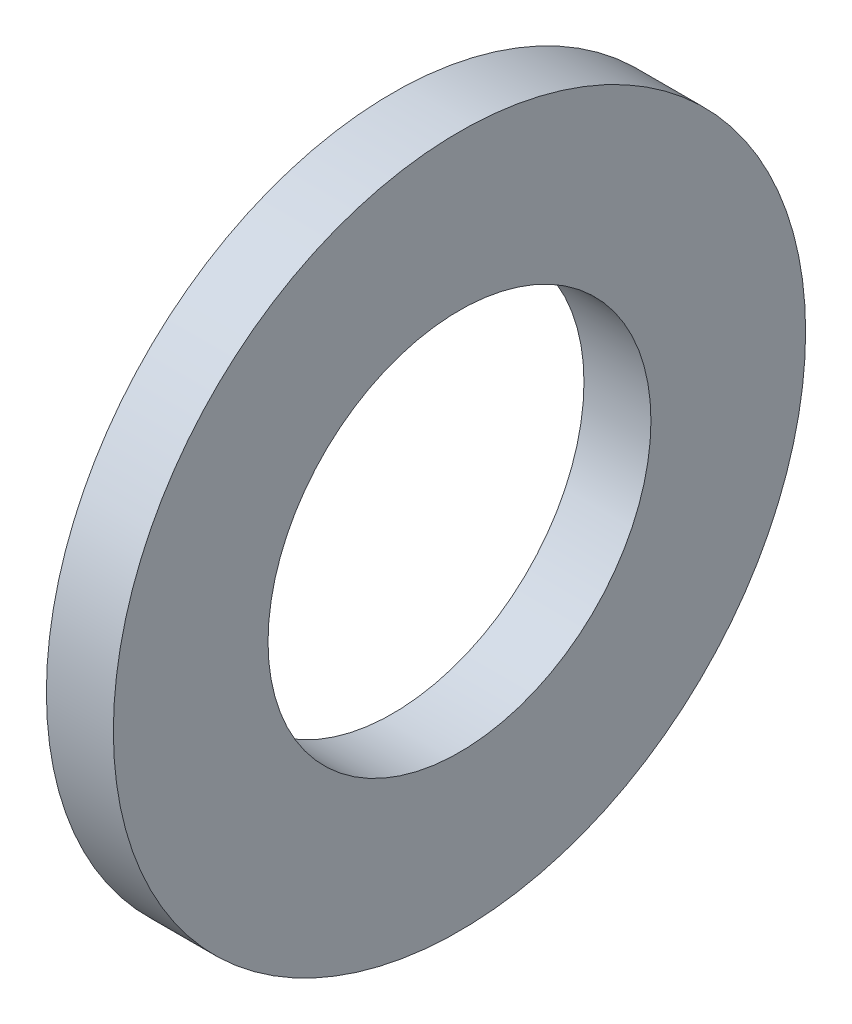
ISO-10303-21;
HEADER;
FILE_DESCRIPTION(('STEP AP214'),'2;1');
FILE_NAME('part.step','',(''),(''),'','','');
FILE_SCHEMA(('AUTOMOTIVE_DESIGN { 1 0 10303 214 1 1 1 1 }'));
ENDSEC;
DATA;
#1=APPLICATION_CONTEXT('core data for automotive mechanical design processes');
#2=APPLICATION_PROTOCOL_DEFINITION('international standard','automotive_design',2000,#1);
#3=PRODUCT_CONTEXT('',#1,'mechanical');
#4=PRODUCT('Part','Part','',(#3));
#5=PRODUCT_RELATED_PRODUCT_CATEGORY('part','',(#4));
#6=PRODUCT_DEFINITION_FORMATION('','',#4);
#7=PRODUCT_DEFINITION_CONTEXT('part definition',#1,'design');
#8=PRODUCT_DEFINITION('design','',#6,#7);
#9=PRODUCT_DEFINITION_SHAPE('','',#8);
#10=(LENGTH_UNIT() NAMED_UNIT(*) SI_UNIT(.MILLI.,.METRE.));
#11=(NAMED_UNIT(*) PLANE_ANGLE_UNIT() SI_UNIT($,.RADIAN.));
#12=(NAMED_UNIT(*) SI_UNIT($,.STERADIAN.) SOLID_ANGLE_UNIT());
#13=UNCERTAINTY_MEASURE_WITH_UNIT(LENGTH_MEASURE(1.E-05),#10,'distance_accuracy_value','');
#14=(GEOMETRIC_REPRESENTATION_CONTEXT(3) GLOBAL_UNCERTAINTY_ASSIGNED_CONTEXT((#13)) GLOBAL_UNIT_ASSIGNED_CONTEXT((#10,
#11,#12)) REPRESENTATION_CONTEXT('',''));
#15=CARTESIAN_POINT('',(0.,0.,0.));
#16=DIRECTION('',(0.,0.,1.));
#17=DIRECTION('',(1.,0.,0.));
#18=AXIS2_PLACEMENT_3D('',#15,#16,#17);
#19=CARTESIAN_POINT('',(1.8034,0.,0.));
#20=DIRECTION('',(1.,0.,0.));
#21=DIRECTION('',(0.,0.,-1.));
#22=AXIS2_PLACEMENT_3D('',#19,#20,#21);
#23=PLANE('',#22);
#24=CARTESIAN_POINT('',(1.8034,0.,0.));
#25=DIRECTION('',(1.,0.,0.));
#26=DIRECTION('',(0.,0.,-1.));
#27=AXIS2_PLACEMENT_3D('',#24,#25,#26);
#28=CIRCLE('',#27,9.3218);
#29=CARTESIAN_POINT('',(1.8034,0.,-9.3218));
#30=VERTEX_POINT('',#29);
#31=EDGE_CURVE('E10',#30,#30,#28,.T.);
#32=ORIENTED_EDGE('',*,*,#31,.T.);
#33=EDGE_LOOP('',(#32));
#34=FACE_BOUND('',#33,.T.);
#35=CARTESIAN_POINT('',(1.8034,0.,0.));
#36=DIRECTION('',(1.,0.,0.));
#37=DIRECTION('',(0.,0.,-1.));
#38=AXIS2_PLACEMENT_3D('',#35,#36,#37);
#39=CIRCLE('',#38,5.1562);
#40=CARTESIAN_POINT('',(1.8034,0.,-5.1562));
#41=VERTEX_POINT('',#40);
#42=EDGE_CURVE('E43',#41,#41,#39,.T.);
#43=ORIENTED_EDGE('',*,*,#42,.F.);
#44=EDGE_LOOP('',(#43));
#45=FACE_BOUND('',#44,.T.);
#46=ADVANCED_FACE('F32',(#34,#45),#23,.T.);
#47=CARTESIAN_POINT('',(0.,0.,0.));
#48=DIRECTION('',(1.,0.,0.));
#49=DIRECTION('',(0.,0.,-1.));
#50=AXIS2_PLACEMENT_3D('',#47,#48,#49);
#51=PLANE('',#50);
#52=CARTESIAN_POINT('',(0.,0.,0.));
#53=DIRECTION('',(1.,0.,0.));
#54=DIRECTION('',(0.,0.,-1.));
#55=AXIS2_PLACEMENT_3D('',#52,#53,#54);
#56=CIRCLE('',#55,9.3218);
#57=CARTESIAN_POINT('',(0.,0.,-9.3218));
#58=VERTEX_POINT('',#57);
#59=EDGE_CURVE('E36',#58,#58,#56,.T.);
#60=ORIENTED_EDGE('',*,*,#59,.F.);
#61=EDGE_LOOP('',(#60));
#62=FACE_BOUND('',#61,.T.);
#63=CARTESIAN_POINT('',(0.,0.,0.));
#64=DIRECTION('',(1.,0.,0.));
#65=DIRECTION('',(0.,0.,-1.));
#66=AXIS2_PLACEMENT_3D('',#63,#64,#65);
#67=CIRCLE('',#66,5.1562);
#68=CARTESIAN_POINT('',(0.,0.,-5.1562));
#69=VERTEX_POINT('',#68);
#70=EDGE_CURVE('E45',#69,#69,#67,.T.);
#71=ORIENTED_EDGE('',*,*,#70,.T.);
#72=EDGE_LOOP('',(#71));
#73=FACE_BOUND('',#72,.T.);
#74=ADVANCED_FACE('F55',(#62,#73),#51,.F.);
#75=CARTESIAN_POINT('',(1.8034,0.,0.));
#76=DIRECTION('',(-1.,0.,0.));
#77=DIRECTION('',(0.,0.,1.));
#78=AXIS2_PLACEMENT_3D('',#75,#76,#77);
#79=CYLINDRICAL_SURFACE('',#78,9.3218);
#80=ORIENTED_EDGE('',*,*,#31,.F.);
#81=EDGE_LOOP('',(#80));
#82=FACE_BOUND('',#81,.T.);
#83=ORIENTED_EDGE('',*,*,#59,.T.);
#84=EDGE_LOOP('',(#83));
#85=FACE_BOUND('',#84,.T.);
#86=ADVANCED_FACE('F34',(#82,#85),#79,.T.);
#87=CARTESIAN_POINT('',(1.8034,0.,0.));
#88=DIRECTION('',(-1.,0.,0.));
#89=DIRECTION('',(0.,0.,1.));
#90=AXIS2_PLACEMENT_3D('',#87,#88,#89);
#91=CYLINDRICAL_SURFACE('',#90,5.1562);
#92=ORIENTED_EDGE('',*,*,#42,.T.);
#93=EDGE_LOOP('',(#92));
#94=FACE_BOUND('',#93,.T.);
#95=ORIENTED_EDGE('',*,*,#70,.F.);
#96=EDGE_LOOP('',(#95));
#97=FACE_BOUND('',#96,.T.);
#98=ADVANCED_FACE('F51',(#94,#97),#91,.F.);
#99=CLOSED_SHELL('',(#46,#74,#86,#98));
#100=MANIFOLD_SOLID_BREP('B2',#99);
#101=ADVANCED_BREP_SHAPE_REPRESENTATION('',(#18,#100),#14);
#102=SHAPE_DEFINITION_REPRESENTATION(#9,#101);
ENDSEC;
END-ISO-10303-21;
